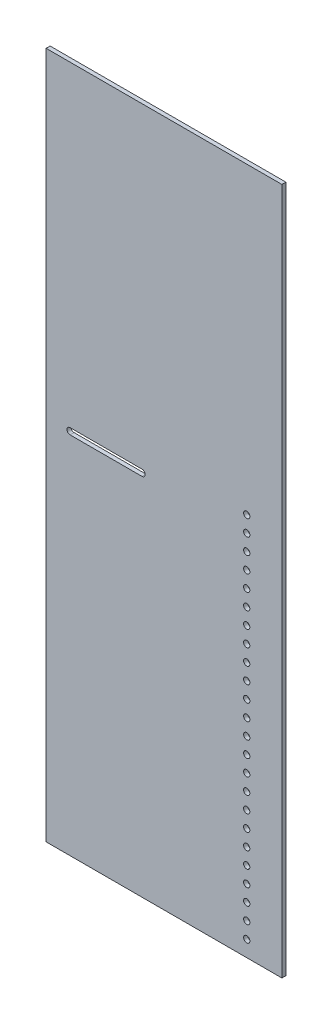
ISO-10303-21;
HEADER;
FILE_DESCRIPTION(('STEP AP214'),'2;1');
FILE_NAME('part.step','',(''),(''),'','','');
FILE_SCHEMA(('AUTOMOTIVE_DESIGN { 1 0 10303 214 1 1 1 1 }'));
ENDSEC;
DATA;
#1=APPLICATION_CONTEXT('core data for automotive mechanical design processes');
#2=APPLICATION_PROTOCOL_DEFINITION('international standard','automotive_design',2000,#1);
#3=PRODUCT_CONTEXT('',#1,'mechanical');
#4=PRODUCT('Part','Part','',(#3));
#5=PRODUCT_RELATED_PRODUCT_CATEGORY('part','',(#4));
#6=PRODUCT_DEFINITION_FORMATION('','',#4);
#7=PRODUCT_DEFINITION_CONTEXT('part definition',#1,'design');
#8=PRODUCT_DEFINITION('design','',#6,#7);
#9=PRODUCT_DEFINITION_SHAPE('','',#8);
#10=(LENGTH_UNIT() NAMED_UNIT(*) SI_UNIT(.MILLI.,.METRE.));
#11=(NAMED_UNIT(*) PLANE_ANGLE_UNIT() SI_UNIT($,.RADIAN.));
#12=(NAMED_UNIT(*) SI_UNIT($,.STERADIAN.) SOLID_ANGLE_UNIT());
#13=UNCERTAINTY_MEASURE_WITH_UNIT(LENGTH_MEASURE(1.E-05),#10,'distance_accuracy_value','');
#14=(GEOMETRIC_REPRESENTATION_CONTEXT(3) GLOBAL_UNCERTAINTY_ASSIGNED_CONTEXT((#13)) GLOBAL_UNIT_ASSIGNED_CONTEXT((#10,
#11,#12)) REPRESENTATION_CONTEXT('',''));
#15=CARTESIAN_POINT('',(0.,0.,0.));
#16=DIRECTION('',(0.,0.,1.));
#17=DIRECTION('',(1.,0.,0.));
#18=AXIS2_PLACEMENT_3D('',#15,#16,#17);
#19=CARTESIAN_POINT('',(0.,0.,3.175));
#20=DIRECTION('',(0.,0.,-1.));
#21=DIRECTION('',(-1.,0.,0.));
#22=AXIS2_PLACEMENT_3D('',#19,#20,#21);
#23=PLANE('',#22);
#24=CARTESIAN_POINT('',(65.7225,-247.65,3.175));
#25=DIRECTION('',(0.,0.,1.));
#26=DIRECTION('',(1.,0.,0.));
#27=AXIS2_PLACEMENT_3D('',#24,#25,#26);
#28=CIRCLE('',#27,2.48919999999998);
#29=CARTESIAN_POINT('',(68.2117,-247.65,3.175));
#30=VERTEX_POINT('',#29);
#31=EDGE_CURVE('E446',#30,#30,#28,.T.);
#32=ORIENTED_EDGE('',*,*,#31,.F.);
#33=EDGE_LOOP('',(#32));
#34=FACE_BOUND('',#33,.T.);
#35=CARTESIAN_POINT('',(65.7224999999999,-234.95,3.175));
#36=DIRECTION('',(0.,0.,1.));
#37=DIRECTION('',(1.,0.,0.));
#38=AXIS2_PLACEMENT_3D('',#35,#36,#37);
#39=CIRCLE('',#38,2.48919999999998);
#40=CARTESIAN_POINT('',(68.2116999999999,-234.95,3.175));
#41=VERTEX_POINT('',#40);
#42=EDGE_CURVE('E438',#41,#41,#39,.T.);
#43=ORIENTED_EDGE('',*,*,#42,.F.);
#44=EDGE_LOOP('',(#43));
#45=FACE_BOUND('',#44,.T.);
#46=CARTESIAN_POINT('',(65.7224999999999,-222.25,3.175));
#47=DIRECTION('',(0.,0.,1.));
#48=DIRECTION('',(1.,0.,0.));
#49=AXIS2_PLACEMENT_3D('',#46,#47,#48);
#50=CIRCLE('',#49,2.48919999999998);
#51=CARTESIAN_POINT('',(68.2116999999999,-222.25,3.175));
#52=VERTEX_POINT('',#51);
#53=EDGE_CURVE('E430',#52,#52,#50,.T.);
#54=ORIENTED_EDGE('',*,*,#53,.F.);
#55=EDGE_LOOP('',(#54));
#56=FACE_BOUND('',#55,.T.);
#57=CARTESIAN_POINT('',(65.7224999999998,-196.85,3.175));
#58=DIRECTION('',(0.,0.,1.));
#59=DIRECTION('',(1.,0.,0.));
#60=AXIS2_PLACEMENT_3D('',#57,#58,#59);
#61=CIRCLE('',#60,2.48919999999998);
#62=CARTESIAN_POINT('',(68.2116999999998,-196.85,3.175));
#63=VERTEX_POINT('',#62);
#64=EDGE_CURVE('E414',#63,#63,#61,.T.);
#65=ORIENTED_EDGE('',*,*,#64,.F.);
#66=EDGE_LOOP('',(#65));
#67=FACE_BOUND('',#66,.T.);
#68=CARTESIAN_POINT('',(65.7224999999997,-171.45,3.175));
#69=DIRECTION('',(0.,0.,1.));
#70=DIRECTION('',(1.,0.,0.));
#71=AXIS2_PLACEMENT_3D('',#68,#69,#70);
#72=CIRCLE('',#71,2.48919999999998);
#73=CARTESIAN_POINT('',(68.2116999999997,-171.45,3.175));
#74=VERTEX_POINT('',#73);
#75=EDGE_CURVE('E398',#74,#74,#72,.T.);
#76=ORIENTED_EDGE('',*,*,#75,.F.);
#77=EDGE_LOOP('',(#76));
#78=FACE_BOUND('',#77,.T.);
#79=CARTESIAN_POINT('',(65.7224999999996,-146.05,3.175));
#80=DIRECTION('',(0.,0.,1.));
#81=DIRECTION('',(1.,0.,0.));
#82=AXIS2_PLACEMENT_3D('',#79,#80,#81);
#83=CIRCLE('',#82,2.48919999999998);
#84=CARTESIAN_POINT('',(68.2116999999996,-146.05,3.175));
#85=VERTEX_POINT('',#84);
#86=EDGE_CURVE('E382',#85,#85,#83,.T.);
#87=ORIENTED_EDGE('',*,*,#86,.F.);
#88=EDGE_LOOP('',(#87));
#89=FACE_BOUND('',#88,.T.);
#90=CARTESIAN_POINT('',(65.7224999999995,-120.65,3.175));
#91=DIRECTION('',(0.,0.,1.));
#92=DIRECTION('',(1.,0.,0.));
#93=AXIS2_PLACEMENT_3D('',#90,#91,#92);
#94=CIRCLE('',#93,2.48919999999998);
#95=CARTESIAN_POINT('',(68.2116999999995,-120.65,3.175));
#96=VERTEX_POINT('',#95);
#97=EDGE_CURVE('E366',#96,#96,#94,.T.);
#98=ORIENTED_EDGE('',*,*,#97,.F.);
#99=EDGE_LOOP('',(#98));
#100=FACE_BOUND('',#99,.T.);
#101=CARTESIAN_POINT('',(65.7224999999994,-95.2500000000002,3.175));
#102=DIRECTION('',(0.,0.,1.));
#103=DIRECTION('',(1.,0.,0.));
#104=AXIS2_PLACEMENT_3D('',#101,#102,#103);
#105=CIRCLE('',#104,2.48919999999998);
#106=CARTESIAN_POINT('',(68.2116999999994,-95.2500000000002,3.175));
#107=VERTEX_POINT('',#106);
#108=EDGE_CURVE('E350',#107,#107,#105,.T.);
#109=ORIENTED_EDGE('',*,*,#108,.F.);
#110=EDGE_LOOP('',(#109));
#111=FACE_BOUND('',#110,.T.);
#112=CARTESIAN_POINT('',(65.7224999999994,-82.5500000000002,3.175));
#113=DIRECTION('',(0.,0.,1.));
#114=DIRECTION('',(1.,0.,0.));
#115=AXIS2_PLACEMENT_3D('',#112,#113,#114);
#116=CIRCLE('',#115,2.48919999999998);
#117=CARTESIAN_POINT('',(68.2116999999994,-82.5500000000002,3.175));
#118=VERTEX_POINT('',#117);
#119=EDGE_CURVE('E342',#118,#118,#116,.T.);
#120=ORIENTED_EDGE('',*,*,#119,.F.);
#121=EDGE_LOOP('',(#120));
#122=FACE_BOUND('',#121,.T.);
#123=CARTESIAN_POINT('',(65.7224999999994,-69.8500000000003,3.175));
#124=DIRECTION('',(0.,0.,1.));
#125=DIRECTION('',(1.,0.,0.));
#126=AXIS2_PLACEMENT_3D('',#123,#124,#125);
#127=CIRCLE('',#126,2.48919999999998);
#128=CARTESIAN_POINT('',(68.2116999999994,-69.8500000000003,3.175));
#129=VERTEX_POINT('',#128);
#130=EDGE_CURVE('E334',#129,#129,#127,.T.);
#131=ORIENTED_EDGE('',*,*,#130,.F.);
#132=EDGE_LOOP('',(#131));
#133=FACE_BOUND('',#132,.T.);
#134=CARTESIAN_POINT('',(65.7224999999993,-44.4500000000003,3.175));
#135=DIRECTION('',(0.,0.,1.));
#136=DIRECTION('',(1.,0.,0.));
#137=AXIS2_PLACEMENT_3D('',#134,#135,#136);
#138=CIRCLE('',#137,2.48919999999998);
#139=CARTESIAN_POINT('',(68.2116999999993,-44.4500000000003,3.175));
#140=VERTEX_POINT('',#139);
#141=EDGE_CURVE('E318',#140,#140,#138,.T.);
#142=ORIENTED_EDGE('',*,*,#141,.F.);
#143=EDGE_LOOP('',(#142));
#144=FACE_BOUND('',#143,.T.);
#145=CARTESIAN_POINT('',(65.7224999999992,-19.0500000000003,3.175));
#146=DIRECTION('',(0.,0.,1.));
#147=DIRECTION('',(1.,0.,0.));
#148=AXIS2_PLACEMENT_3D('',#145,#146,#147);
#149=CIRCLE('',#148,2.48919999999998);
#150=CARTESIAN_POINT('',(68.2116999999992,-19.0500000000003,3.175));
#151=VERTEX_POINT('',#150);
#152=EDGE_CURVE('E302',#151,#151,#149,.T.);
#153=ORIENTED_EDGE('',*,*,#152,.F.);
#154=EDGE_LOOP('',(#153));
#155=FACE_BOUND('',#154,.T.);
#156=CARTESIAN_POINT('',(65.7224999999991,6.34999999999969,3.175));
#157=DIRECTION('',(0.,0.,1.));
#158=DIRECTION('',(1.,0.,0.));
#159=AXIS2_PLACEMENT_3D('',#156,#157,#158);
#160=CIRCLE('',#159,2.48919999999998);
#161=CARTESIAN_POINT('',(68.2116999999991,6.34999999999969,3.175));
#162=VERTEX_POINT('',#161);
#163=EDGE_CURVE('E286',#162,#162,#160,.T.);
#164=ORIENTED_EDGE('',*,*,#163,.F.);
#165=EDGE_LOOP('',(#164));
#166=FACE_BOUND('',#165,.T.);
#167=CARTESIAN_POINT('',(65.7224999999991,19.0499999999997,3.175));
#168=DIRECTION('',(0.,0.,1.));
#169=DIRECTION('',(1.,0.,0.));
#170=AXIS2_PLACEMENT_3D('',#167,#168,#169);
#171=CIRCLE('',#170,2.48919999999998);
#172=CARTESIAN_POINT('',(68.211699999999,19.0499999999997,3.175));
#173=VERTEX_POINT('',#172);
#174=EDGE_CURVE('E276',#173,#173,#171,.T.);
#175=ORIENTED_EDGE('',*,*,#174,.F.);
#176=EDGE_LOOP('',(#175));
#177=FACE_BOUND('',#176,.T.);
#178=CARTESIAN_POINT('',(65.722499999999,31.7499999999997,3.175));
#179=DIRECTION('',(0.,0.,1.));
#180=DIRECTION('',(1.,0.,0.));
#181=AXIS2_PLACEMENT_3D('',#178,#179,#180);
#182=CIRCLE('',#181,2.48919999999998);
#183=CARTESIAN_POINT('',(68.211699999999,31.7499999999997,3.175));
#184=VERTEX_POINT('',#183);
#185=EDGE_CURVE('E269',#184,#184,#182,.T.);
#186=ORIENTED_EDGE('',*,*,#185,.F.);
#187=EDGE_LOOP('',(#186));
#188=FACE_BOUND('',#187,.T.);
#189=DIRECTION('',(1.,0.,0.));
#190=VECTOR('',#189,1.);
#191=CARTESIAN_POINT('',(-74.6125,16.5607999999999,3.175));
#192=LINE('',#191,#190);
#193=CARTESIAN_POINT('',(-74.6125,16.5607999999999,3.175));
#194=VERTEX_POINT('',#193);
#195=CARTESIAN_POINT('',(-17.4625,16.5607999999999,3.175));
#196=VERTEX_POINT('',#195);
#197=EDGE_CURVE('E147',#194,#196,#192,.T.);
#198=ORIENTED_EDGE('',*,*,#197,.F.);
#199=CARTESIAN_POINT('',(-74.6125,19.0499999999999,3.175));
#200=DIRECTION('',(0.,0.,1.));
#201=DIRECTION('',(-1.,0.,0.));
#202=AXIS2_PLACEMENT_3D('',#199,#200,#201);
#203=CIRCLE('',#202,2.4892);
#204=CARTESIAN_POINT('',(-74.6125,21.5391999999999,3.175));
#205=VERTEX_POINT('',#204);
#206=EDGE_CURVE('E60',#205,#194,#203,.T.);
#207=ORIENTED_EDGE('',*,*,#206,.F.);
#208=DIRECTION('',(-1.,0.,0.));
#209=VECTOR('',#208,1.);
#210=CARTESIAN_POINT('',(-17.4625,21.5391999999999,3.175));
#211=LINE('',#210,#209);
#212=CARTESIAN_POINT('',(-17.4625,21.5391999999999,3.175));
#213=VERTEX_POINT('',#212);
#214=EDGE_CURVE('E131',#213,#205,#211,.T.);
#215=ORIENTED_EDGE('',*,*,#214,.F.);
#216=CARTESIAN_POINT('',(-17.4625,19.0499999999999,3.175));
#217=DIRECTION('',(0.,0.,1.));
#218=DIRECTION('',(1.,0.,0.));
#219=AXIS2_PLACEMENT_3D('',#216,#217,#218);
#220=CIRCLE('',#219,2.4892);
#221=EDGE_CURVE('E135',#196,#213,#220,.T.);
#222=ORIENTED_EDGE('',*,*,#221,.F.);
#223=EDGE_LOOP('',(#198,#207,#215,#222));
#224=FACE_BOUND('',#223,.T.);
#225=DIRECTION('',(-1.,0.,0.));
#226=VECTOR('',#225,1.);
#227=CARTESIAN_POINT('',(93.6625,273.05,3.175));
#228=LINE('',#227,#226);
#229=CARTESIAN_POINT('',(93.6625,273.05,3.175));
#230=VERTEX_POINT('',#229);
#231=CARTESIAN_POINT('',(-93.6625,273.05,3.175));
#232=VERTEX_POINT('',#231);
#233=EDGE_CURVE('E162',#230,#232,#228,.T.);
#234=ORIENTED_EDGE('',*,*,#233,.T.);
#235=DIRECTION('',(0.,-1.,0.));
#236=VECTOR('',#235,1.);
#237=CARTESIAN_POINT('',(-93.6625,-273.05,3.175));
#238=LINE('',#237,#236);
#239=CARTESIAN_POINT('',(-93.6625,-273.05,3.175));
#240=VERTEX_POINT('',#239);
#241=EDGE_CURVE('E166',#232,#240,#238,.T.);
#242=ORIENTED_EDGE('',*,*,#241,.T.);
#243=DIRECTION('',(1.,0.,0.));
#244=VECTOR('',#243,1.);
#245=CARTESIAN_POINT('',(93.6625,-273.05,3.175));
#246=LINE('',#245,#244);
#247=CARTESIAN_POINT('',(93.6625,-273.05,3.175));
#248=VERTEX_POINT('',#247);
#249=EDGE_CURVE('E170',#240,#248,#246,.T.);
#250=ORIENTED_EDGE('',*,*,#249,.T.);
#251=DIRECTION('',(0.,1.,0.));
#252=VECTOR('',#251,1.);
#253=CARTESIAN_POINT('',(93.6625,-273.05,3.175));
#254=LINE('',#253,#252);
#255=EDGE_CURVE('E173',#248,#230,#254,.T.);
#256=ORIENTED_EDGE('',*,*,#255,.T.);
#257=EDGE_LOOP('',(#234,#242,#250,#256));
#258=FACE_BOUND('',#257,.T.);
#259=CARTESIAN_POINT('',(65.7224999999991,-6.3500000000003,3.175));
#260=DIRECTION('',(0.,0.,1.));
#261=DIRECTION('',(1.,0.,0.));
#262=AXIS2_PLACEMENT_3D('',#259,#260,#261);
#263=CIRCLE('',#262,2.48919999999998);
#264=CARTESIAN_POINT('',(68.2116999999991,-6.3500000000003,3.175));
#265=VERTEX_POINT('',#264);
#266=EDGE_CURVE('E294',#265,#265,#263,.T.);
#267=ORIENTED_EDGE('',*,*,#266,.F.);
#268=EDGE_LOOP('',(#267));
#269=FACE_BOUND('',#268,.T.);
#270=CARTESIAN_POINT('',(65.7224999999992,-31.7500000000003,3.175));
#271=DIRECTION('',(0.,0.,1.));
#272=DIRECTION('',(1.,0.,0.));
#273=AXIS2_PLACEMENT_3D('',#270,#271,#272);
#274=CIRCLE('',#273,2.48919999999998);
#275=CARTESIAN_POINT('',(68.2116999999992,-31.7500000000003,3.175));
#276=VERTEX_POINT('',#275);
#277=EDGE_CURVE('E310',#276,#276,#274,.T.);
#278=ORIENTED_EDGE('',*,*,#277,.F.);
#279=EDGE_LOOP('',(#278));
#280=FACE_BOUND('',#279,.T.);
#281=CARTESIAN_POINT('',(65.7224999999993,-57.1500000000003,3.175));
#282=DIRECTION('',(0.,0.,1.));
#283=DIRECTION('',(1.,0.,0.));
#284=AXIS2_PLACEMENT_3D('',#281,#282,#283);
#285=CIRCLE('',#284,2.48919999999998);
#286=CARTESIAN_POINT('',(68.2116999999993,-57.1500000000003,3.175));
#287=VERTEX_POINT('',#286);
#288=EDGE_CURVE('E326',#287,#287,#285,.T.);
#289=ORIENTED_EDGE('',*,*,#288,.F.);
#290=EDGE_LOOP('',(#289));
#291=FACE_BOUND('',#290,.T.);
#292=CARTESIAN_POINT('',(65.7224999999995,-107.95,3.175));
#293=DIRECTION('',(0.,0.,1.));
#294=DIRECTION('',(1.,0.,0.));
#295=AXIS2_PLACEMENT_3D('',#292,#293,#294);
#296=CIRCLE('',#295,2.48919999999998);
#297=CARTESIAN_POINT('',(68.2116999999995,-107.95,3.175));
#298=VERTEX_POINT('',#297);
#299=EDGE_CURVE('E358',#298,#298,#296,.T.);
#300=ORIENTED_EDGE('',*,*,#299,.F.);
#301=EDGE_LOOP('',(#300));
#302=FACE_BOUND('',#301,.T.);
#303=CARTESIAN_POINT('',(65.7224999999996,-133.35,3.175));
#304=DIRECTION('',(0.,0.,1.));
#305=DIRECTION('',(1.,0.,0.));
#306=AXIS2_PLACEMENT_3D('',#303,#304,#305);
#307=CIRCLE('',#306,2.48919999999998);
#308=CARTESIAN_POINT('',(68.2116999999996,-133.35,3.175));
#309=VERTEX_POINT('',#308);
#310=EDGE_CURVE('E374',#309,#309,#307,.T.);
#311=ORIENTED_EDGE('',*,*,#310,.F.);
#312=EDGE_LOOP('',(#311));
#313=FACE_BOUND('',#312,.T.);
#314=CARTESIAN_POINT('',(65.7224999999997,-158.75,3.175));
#315=DIRECTION('',(0.,0.,1.));
#316=DIRECTION('',(1.,0.,0.));
#317=AXIS2_PLACEMENT_3D('',#314,#315,#316);
#318=CIRCLE('',#317,2.48919999999998);
#319=CARTESIAN_POINT('',(68.2116999999997,-158.75,3.175));
#320=VERTEX_POINT('',#319);
#321=EDGE_CURVE('E390',#320,#320,#318,.T.);
#322=ORIENTED_EDGE('',*,*,#321,.F.);
#323=EDGE_LOOP('',(#322));
#324=FACE_BOUND('',#323,.T.);
#325=CARTESIAN_POINT('',(65.7224999999998,-184.15,3.175));
#326=DIRECTION('',(0.,0.,1.));
#327=DIRECTION('',(1.,0.,0.));
#328=AXIS2_PLACEMENT_3D('',#325,#326,#327);
#329=CIRCLE('',#328,2.48919999999998);
#330=CARTESIAN_POINT('',(68.2116999999997,-184.15,3.175));
#331=VERTEX_POINT('',#330);
#332=EDGE_CURVE('E406',#331,#331,#329,.T.);
#333=ORIENTED_EDGE('',*,*,#332,.F.);
#334=EDGE_LOOP('',(#333));
#335=FACE_BOUND('',#334,.T.);
#336=CARTESIAN_POINT('',(65.7224999999998,-209.55,3.175));
#337=DIRECTION('',(0.,0.,1.));
#338=DIRECTION('',(1.,0.,0.));
#339=AXIS2_PLACEMENT_3D('',#336,#337,#338);
#340=CIRCLE('',#339,2.48919999999998);
#341=CARTESIAN_POINT('',(68.2116999999998,-209.55,3.175));
#342=VERTEX_POINT('',#341);
#343=EDGE_CURVE('E422',#342,#342,#340,.T.);
#344=ORIENTED_EDGE('',*,*,#343,.F.);
#345=EDGE_LOOP('',(#344));
#346=FACE_BOUND('',#345,.T.);
#347=CARTESIAN_POINT('',(65.7225,-260.35,3.175));
#348=DIRECTION('',(0.,0.,1.));
#349=DIRECTION('',(1.,0.,0.));
#350=AXIS2_PLACEMENT_3D('',#347,#348,#349);
#351=CIRCLE('',#350,2.48919999999998);
#352=CARTESIAN_POINT('',(68.2117,-260.35,3.175));
#353=VERTEX_POINT('',#352);
#354=EDGE_CURVE('E454',#353,#353,#351,.T.);
#355=ORIENTED_EDGE('',*,*,#354,.F.);
#356=EDGE_LOOP('',(#355));
#357=FACE_BOUND('',#356,.T.);
#358=ADVANCED_FACE('F44',(#34,#45,#56,#67,#78,#89,#100,#111,#122,#133,#144,#155,#166,#177,#188,
#224,#258,#269,#280,#291,#302,#313,#324,#335,#346,#357),#23,.F.);
#359=CARTESIAN_POINT('',(0.,0.,0.));
#360=DIRECTION('',(0.,0.,-1.));
#361=DIRECTION('',(-1.,0.,0.));
#362=AXIS2_PLACEMENT_3D('',#359,#360,#361);
#363=PLANE('',#362);
#364=CARTESIAN_POINT('',(65.7225,-260.35,0.));
#365=DIRECTION('',(0.,0.,1.));
#366=DIRECTION('',(1.,0.,0.));
#367=AXIS2_PLACEMENT_3D('',#364,#365,#366);
#368=CIRCLE('',#367,2.4892);
#369=CARTESIAN_POINT('',(68.2117,-260.35,0.));
#370=VERTEX_POINT('',#369);
#371=EDGE_CURVE('E450',#370,#370,#368,.T.);
#372=ORIENTED_EDGE('',*,*,#371,.T.);
#373=EDGE_LOOP('',(#372));
#374=FACE_BOUND('',#373,.T.);
#375=CARTESIAN_POINT('',(65.7225,-247.65,0.));
#376=DIRECTION('',(0.,0.,1.));
#377=DIRECTION('',(1.,0.,0.));
#378=AXIS2_PLACEMENT_3D('',#375,#376,#377);
#379=CIRCLE('',#378,2.4892);
#380=CARTESIAN_POINT('',(68.2117,-247.65,0.));
#381=VERTEX_POINT('',#380);
#382=EDGE_CURVE('E442',#381,#381,#379,.T.);
#383=ORIENTED_EDGE('',*,*,#382,.T.);
#384=EDGE_LOOP('',(#383));
#385=FACE_BOUND('',#384,.T.);
#386=CARTESIAN_POINT('',(65.7224999999999,-234.95,0.));
#387=DIRECTION('',(0.,0.,1.));
#388=DIRECTION('',(1.,0.,0.));
#389=AXIS2_PLACEMENT_3D('',#386,#387,#388);
#390=CIRCLE('',#389,2.4892);
#391=CARTESIAN_POINT('',(68.2116999999999,-234.95,0.));
#392=VERTEX_POINT('',#391);
#393=EDGE_CURVE('E434',#392,#392,#390,.T.);
#394=ORIENTED_EDGE('',*,*,#393,.T.);
#395=EDGE_LOOP('',(#394));
#396=FACE_BOUND('',#395,.T.);
#397=CARTESIAN_POINT('',(65.7224999999998,-196.85,0.));
#398=DIRECTION('',(0.,0.,1.));
#399=DIRECTION('',(1.,0.,0.));
#400=AXIS2_PLACEMENT_3D('',#397,#398,#399);
#401=CIRCLE('',#400,2.4892);
#402=CARTESIAN_POINT('',(68.2116999999998,-196.85,0.));
#403=VERTEX_POINT('',#402);
#404=EDGE_CURVE('E410',#403,#403,#401,.T.);
#405=ORIENTED_EDGE('',*,*,#404,.T.);
#406=EDGE_LOOP('',(#405));
#407=FACE_BOUND('',#406,.T.);
#408=CARTESIAN_POINT('',(65.7224999999998,-184.15,0.));
#409=DIRECTION('',(0.,0.,1.));
#410=DIRECTION('',(1.,0.,0.));
#411=AXIS2_PLACEMENT_3D('',#408,#409,#410);
#412=CIRCLE('',#411,2.4892);
#413=CARTESIAN_POINT('',(68.2116999999998,-184.15,0.));
#414=VERTEX_POINT('',#413);
#415=EDGE_CURVE('E402',#414,#414,#412,.T.);
#416=ORIENTED_EDGE('',*,*,#415,.T.);
#417=EDGE_LOOP('',(#416));
#418=FACE_BOUND('',#417,.T.);
#419=CARTESIAN_POINT('',(65.7224999999996,-146.05,0.));
#420=DIRECTION('',(0.,0.,1.));
#421=DIRECTION('',(1.,0.,0.));
#422=AXIS2_PLACEMENT_3D('',#419,#420,#421);
#423=CIRCLE('',#422,2.4892);
#424=CARTESIAN_POINT('',(68.2116999999996,-146.05,0.));
#425=VERTEX_POINT('',#424);
#426=EDGE_CURVE('E378',#425,#425,#423,.T.);
#427=ORIENTED_EDGE('',*,*,#426,.T.);
#428=EDGE_LOOP('',(#427));
#429=FACE_BOUND('',#428,.T.);
#430=CARTESIAN_POINT('',(65.7224999999996,-133.35,0.));
#431=DIRECTION('',(0.,0.,1.));
#432=DIRECTION('',(1.,0.,0.));
#433=AXIS2_PLACEMENT_3D('',#430,#431,#432);
#434=CIRCLE('',#433,2.4892);
#435=CARTESIAN_POINT('',(68.2116999999996,-133.35,0.));
#436=VERTEX_POINT('',#435);
#437=EDGE_CURVE('E370',#436,#436,#434,.T.);
#438=ORIENTED_EDGE('',*,*,#437,.T.);
#439=EDGE_LOOP('',(#438));
#440=FACE_BOUND('',#439,.T.);
#441=CARTESIAN_POINT('',(65.7224999999994,-69.8500000000003,0.));
#442=DIRECTION('',(0.,0.,1.));
#443=DIRECTION('',(1.,0.,0.));
#444=AXIS2_PLACEMENT_3D('',#441,#442,#443);
#445=CIRCLE('',#444,2.4892);
#446=CARTESIAN_POINT('',(68.2116999999994,-69.8500000000003,0.));
#447=VERTEX_POINT('',#446);
#448=EDGE_CURVE('E330',#447,#447,#445,.T.);
#449=ORIENTED_EDGE('',*,*,#448,.T.);
#450=EDGE_LOOP('',(#449));
#451=FACE_BOUND('',#450,.T.);
#452=CARTESIAN_POINT('',(65.7224999999993,-57.1500000000003,0.));
#453=DIRECTION('',(0.,0.,1.));
#454=DIRECTION('',(1.,0.,0.));
#455=AXIS2_PLACEMENT_3D('',#452,#453,#454);
#456=CIRCLE('',#455,2.4892);
#457=CARTESIAN_POINT('',(68.2116999999993,-57.1500000000003,0.));
#458=VERTEX_POINT('',#457);
#459=EDGE_CURVE('E322',#458,#458,#456,.T.);
#460=ORIENTED_EDGE('',*,*,#459,.T.);
#461=EDGE_LOOP('',(#460));
#462=FACE_BOUND('',#461,.T.);
#463=CARTESIAN_POINT('',(65.7224999999992,-19.0500000000003,0.));
#464=DIRECTION('',(0.,0.,1.));
#465=DIRECTION('',(1.,0.,0.));
#466=AXIS2_PLACEMENT_3D('',#463,#464,#465);
#467=CIRCLE('',#466,2.4892);
#468=CARTESIAN_POINT('',(68.2116999999992,-19.0500000000003,0.));
#469=VERTEX_POINT('',#468);
#470=EDGE_CURVE('E298',#469,#469,#467,.T.);
#471=ORIENTED_EDGE('',*,*,#470,.T.);
#472=EDGE_LOOP('',(#471));
#473=FACE_BOUND('',#472,.T.);
#474=CARTESIAN_POINT('',(65.7224999999991,-6.3500000000003,0.));
#475=DIRECTION('',(0.,0.,1.));
#476=DIRECTION('',(1.,0.,0.));
#477=AXIS2_PLACEMENT_3D('',#474,#475,#476);
#478=CIRCLE('',#477,2.4892);
#479=CARTESIAN_POINT('',(68.2116999999991,-6.3500000000003,0.));
#480=VERTEX_POINT('',#479);
#481=EDGE_CURVE('E290',#480,#480,#478,.T.);
#482=ORIENTED_EDGE('',*,*,#481,.T.);
#483=EDGE_LOOP('',(#482));
#484=FACE_BOUND('',#483,.T.);
#485=DIRECTION('',(-1.,0.,0.));
#486=VECTOR('',#485,1.);
#487=CARTESIAN_POINT('',(93.6625,273.05,0.));
#488=LINE('',#487,#486);
#489=CARTESIAN_POINT('',(93.6625,273.05,0.));
#490=VERTEX_POINT('',#489);
#491=CARTESIAN_POINT('',(-93.6625,273.05,0.));
#492=VERTEX_POINT('',#491);
#493=EDGE_CURVE('E156',#490,#492,#488,.T.);
#494=ORIENTED_EDGE('',*,*,#493,.F.);
#495=DIRECTION('',(0.,1.,0.));
#496=VECTOR('',#495,1.);
#497=CARTESIAN_POINT('',(93.6625,-273.05,0.));
#498=LINE('',#497,#496);
#499=CARTESIAN_POINT('',(93.6625,-273.05,0.));
#500=VERTEX_POINT('',#499);
#501=EDGE_CURVE('E167',#500,#490,#498,.T.);
#502=ORIENTED_EDGE('',*,*,#501,.F.);
#503=DIRECTION('',(1.,0.,0.));
#504=VECTOR('',#503,1.);
#505=CARTESIAN_POINT('',(93.6625,-273.05,0.));
#506=LINE('',#505,#504);
#507=CARTESIAN_POINT('',(-93.6625,-273.05,0.));
#508=VERTEX_POINT('',#507);
#509=EDGE_CURVE('E183',#508,#500,#506,.T.);
#510=ORIENTED_EDGE('',*,*,#509,.F.);
#511=DIRECTION('',(0.,-1.,0.));
#512=VECTOR('',#511,1.);
#513=CARTESIAN_POINT('',(-93.6625,-273.05,0.));
#514=LINE('',#513,#512);
#515=EDGE_CURVE('E180',#492,#508,#514,.T.);
#516=ORIENTED_EDGE('',*,*,#515,.F.);
#517=EDGE_LOOP('',(#494,#502,#510,#516));
#518=FACE_BOUND('',#517,.T.);
#519=CARTESIAN_POINT('',(-74.6125,19.0499999999999,0.));
#520=DIRECTION('',(0.,0.,1.));
#521=DIRECTION('',(-1.,0.,0.));
#522=AXIS2_PLACEMENT_3D('',#519,#520,#521);
#523=CIRCLE('',#522,2.4892);
#524=CARTESIAN_POINT('',(-74.6125,21.5391999999999,0.));
#525=VERTEX_POINT('',#524);
#526=CARTESIAN_POINT('',(-74.6125,16.5607999999999,0.));
#527=VERTEX_POINT('',#526);
#528=EDGE_CURVE('E112',#525,#527,#523,.T.);
#529=ORIENTED_EDGE('',*,*,#528,.T.);
#530=DIRECTION('',(1.,0.,0.));
#531=VECTOR('',#530,1.);
#532=CARTESIAN_POINT('',(-74.6125,16.5607999999999,0.));
#533=LINE('',#532,#531);
#534=CARTESIAN_POINT('',(-17.4625,16.5607999999999,0.));
#535=VERTEX_POINT('',#534);
#536=EDGE_CURVE('E122',#527,#535,#533,.T.);
#537=ORIENTED_EDGE('',*,*,#536,.T.);
#538=CARTESIAN_POINT('',(-17.4625,19.0499999999999,0.));
#539=DIRECTION('',(0.,0.,1.));
#540=DIRECTION('',(1.,0.,0.));
#541=AXIS2_PLACEMENT_3D('',#538,#539,#540);
#542=CIRCLE('',#541,2.4892);
#543=CARTESIAN_POINT('',(-17.4625,21.5391999999999,0.));
#544=VERTEX_POINT('',#543);
#545=EDGE_CURVE('E68',#535,#544,#542,.T.);
#546=ORIENTED_EDGE('',*,*,#545,.T.);
#547=DIRECTION('',(-1.,0.,0.));
#548=VECTOR('',#547,1.);
#549=CARTESIAN_POINT('',(-17.4625,21.5391999999999,0.));
#550=LINE('',#549,#548);
#551=EDGE_CURVE('E119',#544,#525,#550,.T.);
#552=ORIENTED_EDGE('',*,*,#551,.T.);
#553=EDGE_LOOP('',(#529,#537,#546,#552));
#554=FACE_BOUND('',#553,.T.);
#555=CARTESIAN_POINT('',(65.722499999999,31.7499999999997,0.));
#556=DIRECTION('',(0.,0.,1.));
#557=DIRECTION('',(1.,0.,0.));
#558=AXIS2_PLACEMENT_3D('',#555,#556,#557);
#559=CIRCLE('',#558,2.4892);
#560=CARTESIAN_POINT('',(68.211699999999,31.7499999999997,0.));
#561=VERTEX_POINT('',#560);
#562=EDGE_CURVE('E138',#561,#561,#559,.T.);
#563=ORIENTED_EDGE('',*,*,#562,.T.);
#564=EDGE_LOOP('',(#563));
#565=FACE_BOUND('',#564,.T.);
#566=CARTESIAN_POINT('',(65.7224999999991,19.0499999999997,0.));
#567=DIRECTION('',(0.,0.,1.));
#568=DIRECTION('',(1.,0.,0.));
#569=AXIS2_PLACEMENT_3D('',#566,#567,#568);
#570=CIRCLE('',#569,2.4892);
#571=CARTESIAN_POINT('',(68.2116999999991,19.0499999999997,0.));
#572=VERTEX_POINT('',#571);
#573=EDGE_CURVE('E272',#572,#572,#570,.T.);
#574=ORIENTED_EDGE('',*,*,#573,.T.);
#575=EDGE_LOOP('',(#574));
#576=FACE_BOUND('',#575,.T.);
#577=CARTESIAN_POINT('',(65.7224999999991,6.34999999999969,0.));
#578=DIRECTION('',(0.,0.,1.));
#579=DIRECTION('',(1.,0.,0.));
#580=AXIS2_PLACEMENT_3D('',#577,#578,#579);
#581=CIRCLE('',#580,2.4892);
#582=CARTESIAN_POINT('',(68.2116999999991,6.34999999999969,0.));
#583=VERTEX_POINT('',#582);
#584=EDGE_CURVE('E282',#583,#583,#581,.T.);
#585=ORIENTED_EDGE('',*,*,#584,.T.);
#586=EDGE_LOOP('',(#585));
#587=FACE_BOUND('',#586,.T.);
#588=CARTESIAN_POINT('',(65.7224999999992,-31.7500000000003,0.));
#589=DIRECTION('',(0.,0.,1.));
#590=DIRECTION('',(1.,0.,0.));
#591=AXIS2_PLACEMENT_3D('',#588,#589,#590);
#592=CIRCLE('',#591,2.4892);
#593=CARTESIAN_POINT('',(68.2116999999992,-31.7500000000003,0.));
#594=VERTEX_POINT('',#593);
#595=EDGE_CURVE('E306',#594,#594,#592,.T.);
#596=ORIENTED_EDGE('',*,*,#595,.T.);
#597=EDGE_LOOP('',(#596));
#598=FACE_BOUND('',#597,.T.);
#599=CARTESIAN_POINT('',(65.7224999999993,-44.4500000000003,0.));
#600=DIRECTION('',(0.,0.,1.));
#601=DIRECTION('',(1.,0.,0.));
#602=AXIS2_PLACEMENT_3D('',#599,#600,#601);
#603=CIRCLE('',#602,2.4892);
#604=CARTESIAN_POINT('',(68.2116999999993,-44.4500000000003,0.));
#605=VERTEX_POINT('',#604);
#606=EDGE_CURVE('E314',#605,#605,#603,.T.);
#607=ORIENTED_EDGE('',*,*,#606,.T.);
#608=EDGE_LOOP('',(#607));
#609=FACE_BOUND('',#608,.T.);
#610=CARTESIAN_POINT('',(65.7224999999994,-82.5500000000002,0.));
#611=DIRECTION('',(0.,0.,1.));
#612=DIRECTION('',(1.,0.,0.));
#613=AXIS2_PLACEMENT_3D('',#610,#611,#612);
#614=CIRCLE('',#613,2.4892);
#615=CARTESIAN_POINT('',(68.2116999999994,-82.5500000000002,0.));
#616=VERTEX_POINT('',#615);
#617=EDGE_CURVE('E338',#616,#616,#614,.T.);
#618=ORIENTED_EDGE('',*,*,#617,.T.);
#619=EDGE_LOOP('',(#618));
#620=FACE_BOUND('',#619,.T.);
#621=CARTESIAN_POINT('',(65.7224999999994,-95.2500000000002,0.));
#622=DIRECTION('',(0.,0.,1.));
#623=DIRECTION('',(1.,0.,0.));
#624=AXIS2_PLACEMENT_3D('',#621,#622,#623);
#625=CIRCLE('',#624,2.4892);
#626=CARTESIAN_POINT('',(68.2116999999994,-95.2500000000002,0.));
#627=VERTEX_POINT('',#626);
#628=EDGE_CURVE('E346',#627,#627,#625,.T.);
#629=ORIENTED_EDGE('',*,*,#628,.T.);
#630=EDGE_LOOP('',(#629));
#631=FACE_BOUND('',#630,.T.);
#632=CARTESIAN_POINT('',(65.7224999999995,-107.95,0.));
#633=DIRECTION('',(0.,0.,1.));
#634=DIRECTION('',(1.,0.,0.));
#635=AXIS2_PLACEMENT_3D('',#632,#633,#634);
#636=CIRCLE('',#635,2.4892);
#637=CARTESIAN_POINT('',(68.2116999999995,-107.95,0.));
#638=VERTEX_POINT('',#637);
#639=EDGE_CURVE('E354',#638,#638,#636,.T.);
#640=ORIENTED_EDGE('',*,*,#639,.T.);
#641=EDGE_LOOP('',(#640));
#642=FACE_BOUND('',#641,.T.);
#643=CARTESIAN_POINT('',(65.7224999999995,-120.65,0.));
#644=DIRECTION('',(0.,0.,1.));
#645=DIRECTION('',(1.,0.,0.));
#646=AXIS2_PLACEMENT_3D('',#643,#644,#645);
#647=CIRCLE('',#646,2.4892);
#648=CARTESIAN_POINT('',(68.2116999999995,-120.65,0.));
#649=VERTEX_POINT('',#648);
#650=EDGE_CURVE('E362',#649,#649,#647,.T.);
#651=ORIENTED_EDGE('',*,*,#650,.T.);
#652=EDGE_LOOP('',(#651));
#653=FACE_BOUND('',#652,.T.);
#654=CARTESIAN_POINT('',(65.7224999999997,-158.75,0.));
#655=DIRECTION('',(0.,0.,1.));
#656=DIRECTION('',(1.,0.,0.));
#657=AXIS2_PLACEMENT_3D('',#654,#655,#656);
#658=CIRCLE('',#657,2.4892);
#659=CARTESIAN_POINT('',(68.2116999999997,-158.75,0.));
#660=VERTEX_POINT('',#659);
#661=EDGE_CURVE('E386',#660,#660,#658,.T.);
#662=ORIENTED_EDGE('',*,*,#661,.T.);
#663=EDGE_LOOP('',(#662));
#664=FACE_BOUND('',#663,.T.);
#665=CARTESIAN_POINT('',(65.7224999999997,-171.45,0.));
#666=DIRECTION('',(0.,0.,1.));
#667=DIRECTION('',(1.,0.,0.));
#668=AXIS2_PLACEMENT_3D('',#665,#666,#667);
#669=CIRCLE('',#668,2.4892);
#670=CARTESIAN_POINT('',(68.2116999999997,-171.45,0.));
#671=VERTEX_POINT('',#670);
#672=EDGE_CURVE('E394',#671,#671,#669,.T.);
#673=ORIENTED_EDGE('',*,*,#672,.T.);
#674=EDGE_LOOP('',(#673));
#675=FACE_BOUND('',#674,.T.);
#676=CARTESIAN_POINT('',(65.7224999999998,-209.55,0.));
#677=DIRECTION('',(0.,0.,1.));
#678=DIRECTION('',(1.,0.,0.));
#679=AXIS2_PLACEMENT_3D('',#676,#677,#678);
#680=CIRCLE('',#679,2.4892);
#681=CARTESIAN_POINT('',(68.2116999999998,-209.55,0.));
#682=VERTEX_POINT('',#681);
#683=EDGE_CURVE('E418',#682,#682,#680,.T.);
#684=ORIENTED_EDGE('',*,*,#683,.T.);
#685=EDGE_LOOP('',(#684));
#686=FACE_BOUND('',#685,.T.);
#687=CARTESIAN_POINT('',(65.7224999999999,-222.25,0.));
#688=DIRECTION('',(0.,0.,1.));
#689=DIRECTION('',(1.,0.,0.));
#690=AXIS2_PLACEMENT_3D('',#687,#688,#689);
#691=CIRCLE('',#690,2.4892);
#692=CARTESIAN_POINT('',(68.2116999999999,-222.25,0.));
#693=VERTEX_POINT('',#692);
#694=EDGE_CURVE('E426',#693,#693,#691,.T.);
#695=ORIENTED_EDGE('',*,*,#694,.T.);
#696=EDGE_LOOP('',(#695));
#697=FACE_BOUND('',#696,.T.);
#698=ADVANCED_FACE('F127',(#374,#385,#396,#407,#418,#429,#440,#451,#462,#473,#484,#518,#554,
#565,#576,#587,#598,#609,#620,#631,#642,#653,#664,#675,#686,#697),#363,.T.);
#699=CARTESIAN_POINT('',(93.6625,273.05,3.175));
#700=DIRECTION('',(0.,-1.,0.));
#701=DIRECTION('',(0.,0.,-1.));
#702=AXIS2_PLACEMENT_3D('',#699,#700,#701);
#703=PLANE('',#702);
#704=ORIENTED_EDGE('',*,*,#493,.T.);
#705=DIRECTION('',(0.,0.,-1.));
#706=VECTOR('',#705,1.);
#707=CARTESIAN_POINT('',(-93.6625,273.05,3.175));
#708=LINE('',#707,#706);
#709=EDGE_CURVE('E11',#232,#492,#708,.T.);
#710=ORIENTED_EDGE('',*,*,#709,.F.);
#711=ORIENTED_EDGE('',*,*,#233,.F.);
#712=DIRECTION('',(0.,0.,-1.));
#713=VECTOR('',#712,1.);
#714=CARTESIAN_POINT('',(93.6625,273.05,3.175));
#715=LINE('',#714,#713);
#716=EDGE_CURVE('E176',#230,#490,#715,.T.);
#717=ORIENTED_EDGE('',*,*,#716,.T.);
#718=EDGE_LOOP('',(#704,#710,#711,#717));
#719=FACE_BOUND('',#718,.T.);
#720=ADVANCED_FACE('F46',(#719),#703,.F.);
#721=CARTESIAN_POINT('',(-93.6625,-273.05,3.175));
#722=DIRECTION('',(1.,0.,0.));
#723=DIRECTION('',(0.,0.,-1.));
#724=AXIS2_PLACEMENT_3D('',#721,#722,#723);
#725=PLANE('',#724);
#726=ORIENTED_EDGE('',*,*,#515,.T.);
#727=DIRECTION('',(0.,0.,-1.));
#728=VECTOR('',#727,1.);
#729=CARTESIAN_POINT('',(-93.6625,-273.05,3.175));
#730=LINE('',#729,#728);
#731=EDGE_CURVE('E53',#240,#508,#730,.T.);
#732=ORIENTED_EDGE('',*,*,#731,.F.);
#733=ORIENTED_EDGE('',*,*,#241,.F.);
#734=ORIENTED_EDGE('',*,*,#709,.T.);
#735=EDGE_LOOP('',(#726,#732,#733,#734));
#736=FACE_BOUND('',#735,.T.);
#737=ADVANCED_FACE('F215',(#736),#725,.F.);
#738=CARTESIAN_POINT('',(93.6625,-273.05,3.175));
#739=DIRECTION('',(0.,1.,0.));
#740=DIRECTION('',(0.,0.,1.));
#741=AXIS2_PLACEMENT_3D('',#738,#739,#740);
#742=PLANE('',#741);
#743=ORIENTED_EDGE('',*,*,#509,.T.);
#744=DIRECTION('',(0.,0.,-1.));
#745=VECTOR('',#744,1.);
#746=CARTESIAN_POINT('',(93.6625,-273.05,3.175));
#747=LINE('',#746,#745);
#748=EDGE_CURVE('E191',#248,#500,#747,.T.);
#749=ORIENTED_EDGE('',*,*,#748,.F.);
#750=ORIENTED_EDGE('',*,*,#249,.F.);
#751=ORIENTED_EDGE('',*,*,#731,.T.);
#752=EDGE_LOOP('',(#743,#749,#750,#751));
#753=FACE_BOUND('',#752,.T.);
#754=ADVANCED_FACE('F200',(#753),#742,.F.);
#755=CARTESIAN_POINT('',(93.6625,-273.05,3.175));
#756=DIRECTION('',(-1.,0.,0.));
#757=DIRECTION('',(0.,0.,1.));
#758=AXIS2_PLACEMENT_3D('',#755,#756,#757);
#759=PLANE('',#758);
#760=ORIENTED_EDGE('',*,*,#501,.T.);
#761=ORIENTED_EDGE('',*,*,#716,.F.);
#762=ORIENTED_EDGE('',*,*,#255,.F.);
#763=ORIENTED_EDGE('',*,*,#748,.T.);
#764=EDGE_LOOP('',(#760,#761,#762,#763));
#765=FACE_BOUND('',#764,.T.);
#766=ADVANCED_FACE('F208',(#765),#759,.F.);
#767=CARTESIAN_POINT('',(-74.6125,19.0499999999999,0.));
#768=DIRECTION('',(0.,0.,1.));
#769=DIRECTION('',(1.,0.,0.));
#770=AXIS2_PLACEMENT_3D('',#767,#768,#769);
#771=CYLINDRICAL_SURFACE('',#770,2.4892);
#772=ORIENTED_EDGE('',*,*,#206,.T.);
#773=DIRECTION('',(0.,0.,1.));
#774=VECTOR('',#773,1.);
#775=CARTESIAN_POINT('',(-74.6125,16.5607999999999,0.));
#776=LINE('',#775,#774);
#777=EDGE_CURVE('E108',#527,#194,#776,.T.);
#778=ORIENTED_EDGE('',*,*,#777,.F.);
#779=ORIENTED_EDGE('',*,*,#528,.F.);
#780=DIRECTION('',(0.,0.,1.));
#781=VECTOR('',#780,1.);
#782=CARTESIAN_POINT('',(-74.6125,21.5391999999999,0.));
#783=LINE('',#782,#781);
#784=EDGE_CURVE('E153',#525,#205,#783,.T.);
#785=ORIENTED_EDGE('',*,*,#784,.T.);
#786=EDGE_LOOP('',(#772,#778,#779,#785));
#787=FACE_BOUND('',#786,.T.);
#788=ADVANCED_FACE('F110',(#787),#771,.F.);
#789=CARTESIAN_POINT('',(-17.4625,21.5391999999999,0.));
#790=DIRECTION('',(0.,1.,0.));
#791=DIRECTION('',(-1.,0.,0.));
#792=AXIS2_PLACEMENT_3D('',#789,#790,#791);
#793=PLANE('',#792);
#794=ORIENTED_EDGE('',*,*,#214,.T.);
#795=ORIENTED_EDGE('',*,*,#784,.F.);
#796=ORIENTED_EDGE('',*,*,#551,.F.);
#797=DIRECTION('',(0.,0.,1.));
#798=VECTOR('',#797,1.);
#799=CARTESIAN_POINT('',(-17.4625,21.5391999999999,0.));
#800=LINE('',#799,#798);
#801=EDGE_CURVE('E157',#544,#213,#800,.T.);
#802=ORIENTED_EDGE('',*,*,#801,.T.);
#803=EDGE_LOOP('',(#794,#795,#796,#802));
#804=FACE_BOUND('',#803,.T.);
#805=ADVANCED_FACE('F240',(#804),#793,.F.);
#806=CARTESIAN_POINT('',(-17.4625,19.0499999999999,0.));
#807=DIRECTION('',(0.,0.,1.));
#808=DIRECTION('',(1.,0.,0.));
#809=AXIS2_PLACEMENT_3D('',#806,#807,#808);
#810=CYLINDRICAL_SURFACE('',#809,2.4892);
#811=ORIENTED_EDGE('',*,*,#221,.T.);
#812=ORIENTED_EDGE('',*,*,#801,.F.);
#813=ORIENTED_EDGE('',*,*,#545,.F.);
#814=DIRECTION('',(0.,0.,1.));
#815=VECTOR('',#814,1.);
#816=CARTESIAN_POINT('',(-17.4625,16.5607999999999,0.));
#817=LINE('',#816,#815);
#818=EDGE_CURVE('E118',#535,#196,#817,.T.);
#819=ORIENTED_EDGE('',*,*,#818,.T.);
#820=EDGE_LOOP('',(#811,#812,#813,#819));
#821=FACE_BOUND('',#820,.T.);
#822=ADVANCED_FACE('F244',(#821),#810,.F.);
#823=CARTESIAN_POINT('',(-74.6125,16.5607999999999,0.));
#824=DIRECTION('',(0.,-1.,0.));
#825=DIRECTION('',(0.,0.,-1.));
#826=AXIS2_PLACEMENT_3D('',#823,#824,#825);
#827=PLANE('',#826);
#828=ORIENTED_EDGE('',*,*,#197,.T.);
#829=ORIENTED_EDGE('',*,*,#818,.F.);
#830=ORIENTED_EDGE('',*,*,#536,.F.);
#831=ORIENTED_EDGE('',*,*,#777,.T.);
#832=EDGE_LOOP('',(#828,#829,#830,#831));
#833=FACE_BOUND('',#832,.T.);
#834=ADVANCED_FACE('F123',(#833),#827,.F.);
#835=CARTESIAN_POINT('',(65.722499999999,31.7499999999997,3.175));
#836=DIRECTION('',(0.,0.,1.));
#837=DIRECTION('',(1.,0.,0.));
#838=AXIS2_PLACEMENT_3D('',#835,#836,#837);
#839=CYLINDRICAL_SURFACE('',#838,2.48919999999999);
#840=ORIENTED_EDGE('',*,*,#562,.F.);
#841=EDGE_LOOP('',(#840));
#842=FACE_BOUND('',#841,.T.);
#843=ORIENTED_EDGE('',*,*,#185,.T.);
#844=EDGE_LOOP('',(#843));
#845=FACE_BOUND('',#844,.T.);
#846=ADVANCED_FACE('F252',(#842,#845),#839,.F.);
#847=CARTESIAN_POINT('',(65.7224999999991,19.0499999999997,3.175));
#848=DIRECTION('',(0.,0.,1.));
#849=DIRECTION('',(1.,0.,0.));
#850=AXIS2_PLACEMENT_3D('',#847,#848,#849);
#851=CYLINDRICAL_SURFACE('',#850,2.48919999999999);
#852=ORIENTED_EDGE('',*,*,#573,.F.);
#853=EDGE_LOOP('',(#852));
#854=FACE_BOUND('',#853,.T.);
#855=ORIENTED_EDGE('',*,*,#174,.T.);
#856=EDGE_LOOP('',(#855));
#857=FACE_BOUND('',#856,.T.);
#858=ADVANCED_FACE('F257',(#854,#857),#851,.F.);
#859=CARTESIAN_POINT('',(65.7224999999991,6.34999999999969,3.175));
#860=DIRECTION('',(0.,0.,1.));
#861=DIRECTION('',(1.,0.,0.));
#862=AXIS2_PLACEMENT_3D('',#859,#860,#861);
#863=CYLINDRICAL_SURFACE('',#862,2.48919999999999);
#864=ORIENTED_EDGE('',*,*,#584,.F.);
#865=EDGE_LOOP('',(#864));
#866=FACE_BOUND('',#865,.T.);
#867=ORIENTED_EDGE('',*,*,#163,.T.);
#868=EDGE_LOOP('',(#867));
#869=FACE_BOUND('',#868,.T.);
#870=ADVANCED_FACE('F262',(#866,#869),#863,.F.);
#871=CARTESIAN_POINT('',(65.7224999999991,-6.3500000000003,3.175));
#872=DIRECTION('',(0.,0.,1.));
#873=DIRECTION('',(1.,0.,0.));
#874=AXIS2_PLACEMENT_3D('',#871,#872,#873);
#875=CYLINDRICAL_SURFACE('',#874,2.48919999999999);
#876=ORIENTED_EDGE('',*,*,#481,.F.);
#877=EDGE_LOOP('',(#876));
#878=FACE_BOUND('',#877,.T.);
#879=ORIENTED_EDGE('',*,*,#266,.T.);
#880=EDGE_LOOP('',(#879));
#881=FACE_BOUND('',#880,.T.);
#882=ADVANCED_FACE('F543',(#878,#881),#875,.F.);
#883=CARTESIAN_POINT('',(65.7224999999992,-19.0500000000003,3.175));
#884=DIRECTION('',(0.,0.,1.));
#885=DIRECTION('',(1.,0.,0.));
#886=AXIS2_PLACEMENT_3D('',#883,#884,#885);
#887=CYLINDRICAL_SURFACE('',#886,2.48919999999999);
#888=ORIENTED_EDGE('',*,*,#470,.F.);
#889=EDGE_LOOP('',(#888));
#890=FACE_BOUND('',#889,.T.);
#891=ORIENTED_EDGE('',*,*,#152,.T.);
#892=EDGE_LOOP('',(#891));
#893=FACE_BOUND('',#892,.T.);
#894=ADVANCED_FACE('F539',(#890,#893),#887,.F.);
#895=CARTESIAN_POINT('',(65.7224999999992,-31.7500000000003,3.175));
#896=DIRECTION('',(0.,0.,1.));
#897=DIRECTION('',(1.,0.,0.));
#898=AXIS2_PLACEMENT_3D('',#895,#896,#897);
#899=CYLINDRICAL_SURFACE('',#898,2.48919999999999);
#900=ORIENTED_EDGE('',*,*,#595,.F.);
#901=EDGE_LOOP('',(#900));
#902=FACE_BOUND('',#901,.T.);
#903=ORIENTED_EDGE('',*,*,#277,.T.);
#904=EDGE_LOOP('',(#903));
#905=FACE_BOUND('',#904,.T.);
#906=ADVANCED_FACE('F535',(#902,#905),#899,.F.);
#907=CARTESIAN_POINT('',(65.7224999999993,-44.4500000000003,3.175));
#908=DIRECTION('',(0.,0.,1.));
#909=DIRECTION('',(1.,0.,0.));
#910=AXIS2_PLACEMENT_3D('',#907,#908,#909);
#911=CYLINDRICAL_SURFACE('',#910,2.48919999999999);
#912=ORIENTED_EDGE('',*,*,#606,.F.);
#913=EDGE_LOOP('',(#912));
#914=FACE_BOUND('',#913,.T.);
#915=ORIENTED_EDGE('',*,*,#141,.T.);
#916=EDGE_LOOP('',(#915));
#917=FACE_BOUND('',#916,.T.);
#918=ADVANCED_FACE('F531',(#914,#917),#911,.F.);
#919=CARTESIAN_POINT('',(65.7224999999993,-57.1500000000003,3.175));
#920=DIRECTION('',(0.,0.,1.));
#921=DIRECTION('',(1.,0.,0.));
#922=AXIS2_PLACEMENT_3D('',#919,#920,#921);
#923=CYLINDRICAL_SURFACE('',#922,2.48919999999999);
#924=ORIENTED_EDGE('',*,*,#459,.F.);
#925=EDGE_LOOP('',(#924));
#926=FACE_BOUND('',#925,.T.);
#927=ORIENTED_EDGE('',*,*,#288,.T.);
#928=EDGE_LOOP('',(#927));
#929=FACE_BOUND('',#928,.T.);
#930=ADVANCED_FACE('F527',(#926,#929),#923,.F.);
#931=CARTESIAN_POINT('',(65.7224999999994,-69.8500000000003,3.175));
#932=DIRECTION('',(0.,0.,1.));
#933=DIRECTION('',(1.,0.,0.));
#934=AXIS2_PLACEMENT_3D('',#931,#932,#933);
#935=CYLINDRICAL_SURFACE('',#934,2.48919999999999);
#936=ORIENTED_EDGE('',*,*,#448,.F.);
#937=EDGE_LOOP('',(#936));
#938=FACE_BOUND('',#937,.T.);
#939=ORIENTED_EDGE('',*,*,#130,.T.);
#940=EDGE_LOOP('',(#939));
#941=FACE_BOUND('',#940,.T.);
#942=ADVANCED_FACE('F523',(#938,#941),#935,.F.);
#943=CARTESIAN_POINT('',(65.7224999999994,-82.5500000000002,3.175));
#944=DIRECTION('',(0.,0.,1.));
#945=DIRECTION('',(1.,0.,0.));
#946=AXIS2_PLACEMENT_3D('',#943,#944,#945);
#947=CYLINDRICAL_SURFACE('',#946,2.48919999999999);
#948=ORIENTED_EDGE('',*,*,#617,.F.);
#949=EDGE_LOOP('',(#948));
#950=FACE_BOUND('',#949,.T.);
#951=ORIENTED_EDGE('',*,*,#119,.T.);
#952=EDGE_LOOP('',(#951));
#953=FACE_BOUND('',#952,.T.);
#954=ADVANCED_FACE('F519',(#950,#953),#947,.F.);
#955=CARTESIAN_POINT('',(65.7224999999994,-95.2500000000002,3.175));
#956=DIRECTION('',(0.,0.,1.));
#957=DIRECTION('',(1.,0.,0.));
#958=AXIS2_PLACEMENT_3D('',#955,#956,#957);
#959=CYLINDRICAL_SURFACE('',#958,2.48919999999999);
#960=ORIENTED_EDGE('',*,*,#628,.F.);
#961=EDGE_LOOP('',(#960));
#962=FACE_BOUND('',#961,.T.);
#963=ORIENTED_EDGE('',*,*,#108,.T.);
#964=EDGE_LOOP('',(#963));
#965=FACE_BOUND('',#964,.T.);
#966=ADVANCED_FACE('F515',(#962,#965),#959,.F.);
#967=CARTESIAN_POINT('',(65.7224999999995,-107.95,3.175));
#968=DIRECTION('',(0.,0.,1.));
#969=DIRECTION('',(1.,0.,0.));
#970=AXIS2_PLACEMENT_3D('',#967,#968,#969);
#971=CYLINDRICAL_SURFACE('',#970,2.48919999999999);
#972=ORIENTED_EDGE('',*,*,#639,.F.);
#973=EDGE_LOOP('',(#972));
#974=FACE_BOUND('',#973,.T.);
#975=ORIENTED_EDGE('',*,*,#299,.T.);
#976=EDGE_LOOP('',(#975));
#977=FACE_BOUND('',#976,.T.);
#978=ADVANCED_FACE('F511',(#974,#977),#971,.F.);
#979=CARTESIAN_POINT('',(65.7224999999995,-120.65,3.175));
#980=DIRECTION('',(0.,0.,1.));
#981=DIRECTION('',(1.,0.,0.));
#982=AXIS2_PLACEMENT_3D('',#979,#980,#981);
#983=CYLINDRICAL_SURFACE('',#982,2.48919999999999);
#984=ORIENTED_EDGE('',*,*,#650,.F.);
#985=EDGE_LOOP('',(#984));
#986=FACE_BOUND('',#985,.T.);
#987=ORIENTED_EDGE('',*,*,#97,.T.);
#988=EDGE_LOOP('',(#987));
#989=FACE_BOUND('',#988,.T.);
#990=ADVANCED_FACE('F507',(#986,#989),#983,.F.);
#991=CARTESIAN_POINT('',(65.7224999999996,-133.35,3.175));
#992=DIRECTION('',(0.,0.,1.));
#993=DIRECTION('',(1.,0.,0.));
#994=AXIS2_PLACEMENT_3D('',#991,#992,#993);
#995=CYLINDRICAL_SURFACE('',#994,2.48919999999999);
#996=ORIENTED_EDGE('',*,*,#437,.F.);
#997=EDGE_LOOP('',(#996));
#998=FACE_BOUND('',#997,.T.);
#999=ORIENTED_EDGE('',*,*,#310,.T.);
#1000=EDGE_LOOP('',(#999));
#1001=FACE_BOUND('',#1000,.T.);
#1002=ADVANCED_FACE('F503',(#998,#1001),#995,.F.);
#1003=CARTESIAN_POINT('',(65.7224999999996,-146.05,3.175));
#1004=DIRECTION('',(0.,0.,1.));
#1005=DIRECTION('',(1.,0.,0.));
#1006=AXIS2_PLACEMENT_3D('',#1003,#1004,#1005);
#1007=CYLINDRICAL_SURFACE('',#1006,2.48919999999999);
#1008=ORIENTED_EDGE('',*,*,#426,.F.);
#1009=EDGE_LOOP('',(#1008));
#1010=FACE_BOUND('',#1009,.T.);
#1011=ORIENTED_EDGE('',*,*,#86,.T.);
#1012=EDGE_LOOP('',(#1011));
#1013=FACE_BOUND('',#1012,.T.);
#1014=ADVANCED_FACE('F499',(#1010,#1013),#1007,.F.);
#1015=CARTESIAN_POINT('',(65.7224999999997,-158.75,3.175));
#1016=DIRECTION('',(0.,0.,1.));
#1017=DIRECTION('',(1.,0.,0.));
#1018=AXIS2_PLACEMENT_3D('',#1015,#1016,#1017);
#1019=CYLINDRICAL_SURFACE('',#1018,2.48919999999999);
#1020=ORIENTED_EDGE('',*,*,#661,.F.);
#1021=EDGE_LOOP('',(#1020));
#1022=FACE_BOUND('',#1021,.T.);
#1023=ORIENTED_EDGE('',*,*,#321,.T.);
#1024=EDGE_LOOP('',(#1023));
#1025=FACE_BOUND('',#1024,.T.);
#1026=ADVANCED_FACE('F495',(#1022,#1025),#1019,.F.);
#1027=CARTESIAN_POINT('',(65.7224999999997,-171.45,3.175));
#1028=DIRECTION('',(0.,0.,1.));
#1029=DIRECTION('',(1.,0.,0.));
#1030=AXIS2_PLACEMENT_3D('',#1027,#1028,#1029);
#1031=CYLINDRICAL_SURFACE('',#1030,2.48919999999999);
#1032=ORIENTED_EDGE('',*,*,#672,.F.);
#1033=EDGE_LOOP('',(#1032));
#1034=FACE_BOUND('',#1033,.T.);
#1035=ORIENTED_EDGE('',*,*,#75,.T.);
#1036=EDGE_LOOP('',(#1035));
#1037=FACE_BOUND('',#1036,.T.);
#1038=ADVANCED_FACE('F491',(#1034,#1037),#1031,.F.);
#1039=CARTESIAN_POINT('',(65.7224999999998,-184.15,3.175));
#1040=DIRECTION('',(0.,0.,1.));
#1041=DIRECTION('',(1.,0.,0.));
#1042=AXIS2_PLACEMENT_3D('',#1039,#1040,#1041);
#1043=CYLINDRICAL_SURFACE('',#1042,2.48919999999999);
#1044=ORIENTED_EDGE('',*,*,#415,.F.);
#1045=EDGE_LOOP('',(#1044));
#1046=FACE_BOUND('',#1045,.T.);
#1047=ORIENTED_EDGE('',*,*,#332,.T.);
#1048=EDGE_LOOP('',(#1047));
#1049=FACE_BOUND('',#1048,.T.);
#1050=ADVANCED_FACE('F487',(#1046,#1049),#1043,.F.);
#1051=CARTESIAN_POINT('',(65.7224999999998,-196.85,3.175));
#1052=DIRECTION('',(0.,0.,1.));
#1053=DIRECTION('',(1.,0.,0.));
#1054=AXIS2_PLACEMENT_3D('',#1051,#1052,#1053);
#1055=CYLINDRICAL_SURFACE('',#1054,2.48919999999999);
#1056=ORIENTED_EDGE('',*,*,#404,.F.);
#1057=EDGE_LOOP('',(#1056));
#1058=FACE_BOUND('',#1057,.T.);
#1059=ORIENTED_EDGE('',*,*,#64,.T.);
#1060=EDGE_LOOP('',(#1059));
#1061=FACE_BOUND('',#1060,.T.);
#1062=ADVANCED_FACE('F483',(#1058,#1061),#1055,.F.);
#1063=CARTESIAN_POINT('',(65.7224999999998,-209.55,3.175));
#1064=DIRECTION('',(0.,0.,1.));
#1065=DIRECTION('',(1.,0.,0.));
#1066=AXIS2_PLACEMENT_3D('',#1063,#1064,#1065);
#1067=CYLINDRICAL_SURFACE('',#1066,2.48919999999999);
#1068=ORIENTED_EDGE('',*,*,#683,.F.);
#1069=EDGE_LOOP('',(#1068));
#1070=FACE_BOUND('',#1069,.T.);
#1071=ORIENTED_EDGE('',*,*,#343,.T.);
#1072=EDGE_LOOP('',(#1071));
#1073=FACE_BOUND('',#1072,.T.);
#1074=ADVANCED_FACE('F479',(#1070,#1073),#1067,.F.);
#1075=CARTESIAN_POINT('',(65.7224999999999,-222.25,3.175));
#1076=DIRECTION('',(0.,0.,1.));
#1077=DIRECTION('',(1.,0.,0.));
#1078=AXIS2_PLACEMENT_3D('',#1075,#1076,#1077);
#1079=CYLINDRICAL_SURFACE('',#1078,2.48919999999999);
#1080=ORIENTED_EDGE('',*,*,#694,.F.);
#1081=EDGE_LOOP('',(#1080));
#1082=FACE_BOUND('',#1081,.T.);
#1083=ORIENTED_EDGE('',*,*,#53,.T.);
#1084=EDGE_LOOP('',(#1083));
#1085=FACE_BOUND('',#1084,.T.);
#1086=ADVANCED_FACE('F475',(#1082,#1085),#1079,.F.);
#1087=CARTESIAN_POINT('',(65.7224999999999,-234.95,3.175));
#1088=DIRECTION('',(0.,0.,1.));
#1089=DIRECTION('',(1.,0.,0.));
#1090=AXIS2_PLACEMENT_3D('',#1087,#1088,#1089);
#1091=CYLINDRICAL_SURFACE('',#1090,2.48919999999999);
#1092=ORIENTED_EDGE('',*,*,#393,.F.);
#1093=EDGE_LOOP('',(#1092));
#1094=FACE_BOUND('',#1093,.T.);
#1095=ORIENTED_EDGE('',*,*,#42,.T.);
#1096=EDGE_LOOP('',(#1095));
#1097=FACE_BOUND('',#1096,.T.);
#1098=ADVANCED_FACE('F468',(#1094,#1097),#1091,.F.);
#1099=CARTESIAN_POINT('',(65.7225,-247.65,3.175));
#1100=DIRECTION('',(0.,0.,1.));
#1101=DIRECTION('',(1.,0.,0.));
#1102=AXIS2_PLACEMENT_3D('',#1099,#1100,#1101);
#1103=CYLINDRICAL_SURFACE('',#1102,2.48919999999999);
#1104=ORIENTED_EDGE('',*,*,#382,.F.);
#1105=EDGE_LOOP('',(#1104));
#1106=FACE_BOUND('',#1105,.T.);
#1107=ORIENTED_EDGE('',*,*,#31,.T.);
#1108=EDGE_LOOP('',(#1107));
#1109=FACE_BOUND('',#1108,.T.);
#1110=ADVANCED_FACE('F462',(#1106,#1109),#1103,.F.);
#1111=CARTESIAN_POINT('',(65.7225,-260.35,3.175));
#1112=DIRECTION('',(0.,0.,1.));
#1113=DIRECTION('',(1.,0.,0.));
#1114=AXIS2_PLACEMENT_3D('',#1111,#1112,#1113);
#1115=CYLINDRICAL_SURFACE('',#1114,2.48919999999999);
#1116=ORIENTED_EDGE('',*,*,#371,.F.);
#1117=EDGE_LOOP('',(#1116));
#1118=FACE_BOUND('',#1117,.T.);
#1119=ORIENTED_EDGE('',*,*,#354,.T.);
#1120=EDGE_LOOP('',(#1119));
#1121=FACE_BOUND('',#1120,.T.);
#1122=ADVANCED_FACE('F459',(#1118,#1121),#1115,.F.);
#1123=CLOSED_SHELL('',(#358,#698,#720,#737,#754,#766,#788,#805,#822,#834,#846,#858,#870,#882,
#894,#906,#918,#930,#942,#954,#966,#978,#990,#1002,#1014,#1026,#1038,#1050,#1062,#1074,#1086,
#1098,#1110,#1122));
#1124=MANIFOLD_SOLID_BREP('B2',#1123);
#1125=ADVANCED_BREP_SHAPE_REPRESENTATION('',(#18,#1124),#14);
#1126=SHAPE_DEFINITION_REPRESENTATION(#9,#1125);
ENDSEC;
END-ISO-10303-21;
